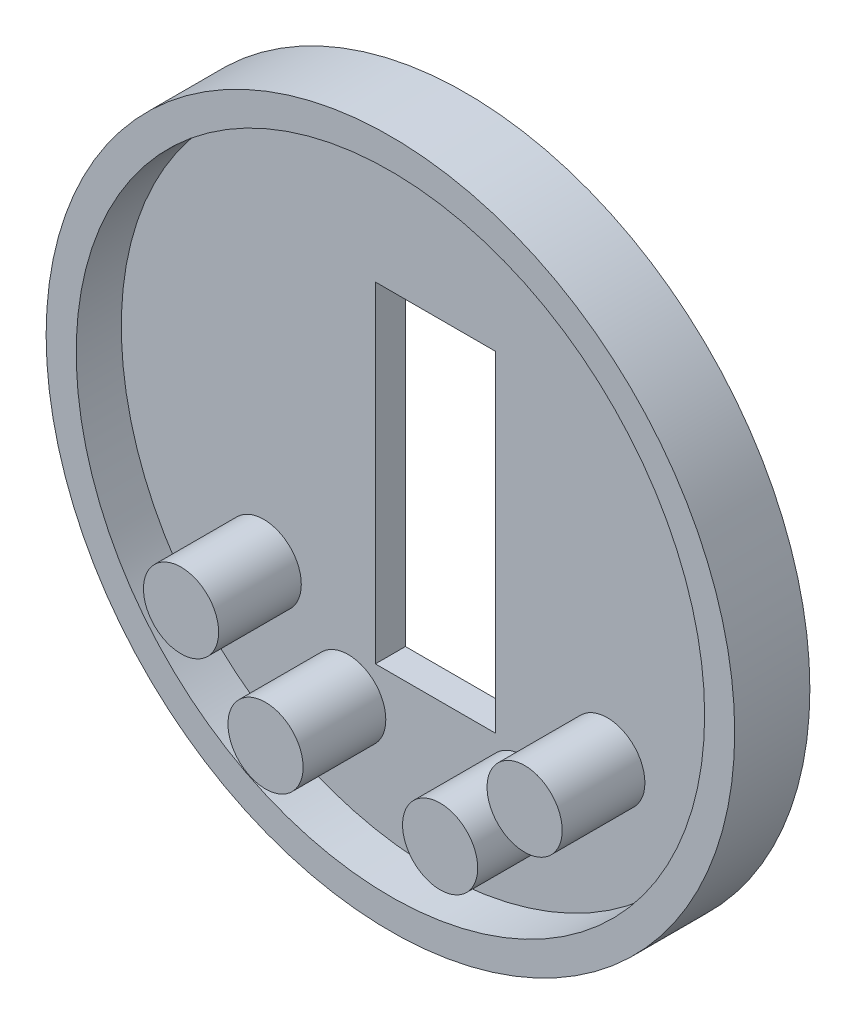
ISO-10303-21;
HEADER;
FILE_DESCRIPTION(('STEP AP214'),'2;1');
FILE_NAME('part.step','',(''),(''),'','','');
FILE_SCHEMA(('AUTOMOTIVE_DESIGN { 1 0 10303 214 1 1 1 1 }'));
ENDSEC;
DATA;
#1=APPLICATION_CONTEXT('core data for automotive mechanical design processes');
#2=APPLICATION_PROTOCOL_DEFINITION('international standard','automotive_design',2000,#1);
#3=PRODUCT_CONTEXT('',#1,'mechanical');
#4=PRODUCT('Part','Part','',(#3));
#5=PRODUCT_RELATED_PRODUCT_CATEGORY('part','',(#4));
#6=PRODUCT_DEFINITION_FORMATION('','',#4);
#7=PRODUCT_DEFINITION_CONTEXT('part definition',#1,'design');
#8=PRODUCT_DEFINITION('design','',#6,#7);
#9=PRODUCT_DEFINITION_SHAPE('','',#8);
#10=(LENGTH_UNIT() NAMED_UNIT(*) SI_UNIT(.MILLI.,.METRE.));
#11=(NAMED_UNIT(*) PLANE_ANGLE_UNIT() SI_UNIT($,.RADIAN.));
#12=(NAMED_UNIT(*) SI_UNIT($,.STERADIAN.) SOLID_ANGLE_UNIT());
#13=UNCERTAINTY_MEASURE_WITH_UNIT(LENGTH_MEASURE(1.E-05),#10,'distance_accuracy_value','');
#14=(GEOMETRIC_REPRESENTATION_CONTEXT(3) GLOBAL_UNCERTAINTY_ASSIGNED_CONTEXT((#13)) GLOBAL_UNIT_ASSIGNED_CONTEXT((#10,
#11,#12)) REPRESENTATION_CONTEXT('',''));
#15=CARTESIAN_POINT('',(0.,0.,0.));
#16=DIRECTION('',(0.,0.,1.));
#17=DIRECTION('',(1.,0.,0.));
#18=AXIS2_PLACEMENT_3D('',#15,#16,#17);
#19=CARTESIAN_POINT('',(0.,0.,0.));
#20=DIRECTION('',(0.,0.,-1.));
#21=DIRECTION('',(-1.,0.,0.));
#22=AXIS2_PLACEMENT_3D('',#19,#20,#21);
#23=PLANE('',#22);
#24=CARTESIAN_POINT('',(0.,0.,0.));
#25=DIRECTION('',(0.,0.,1.));
#26=DIRECTION('',(1.,0.,0.));
#27=AXIS2_PLACEMENT_3D('',#24,#25,#26);
#28=CIRCLE('',#27,22.902);
#29=CARTESIAN_POINT('',(22.902,0.,0.));
#30=VERTEX_POINT('',#29);
#31=EDGE_CURVE('E127',#30,#30,#28,.T.);
#32=ORIENTED_EDGE('',*,*,#31,.F.);
#33=EDGE_LOOP('',(#32));
#34=FACE_BOUND('',#33,.T.);
#35=DIRECTION('',(1.,0.,0.));
#36=VECTOR('',#35,1.);
#37=CARTESIAN_POINT('',(0.,11.,0.));
#38=LINE('',#37,#36);
#39=CARTESIAN_POINT('',(-4.,11.,0.));
#40=VERTEX_POINT('',#39);
#41=CARTESIAN_POINT('',(4.,11.,0.));
#42=VERTEX_POINT('',#41);
#43=EDGE_CURVE('E95',#40,#42,#38,.T.);
#44=ORIENTED_EDGE('',*,*,#43,.F.);
#45=DIRECTION('',(0.,-1.,0.));
#46=VECTOR('',#45,1.);
#47=CARTESIAN_POINT('',(-4.,0.,0.));
#48=LINE('',#47,#46);
#49=CARTESIAN_POINT('',(-4.,-11.,0.));
#50=VERTEX_POINT('',#49);
#51=EDGE_CURVE('E56',#40,#50,#48,.T.);
#52=ORIENTED_EDGE('',*,*,#51,.T.);
#53=DIRECTION('',(1.,0.,0.));
#54=VECTOR('',#53,1.);
#55=CARTESIAN_POINT('',(0.,-11.,0.));
#56=LINE('',#55,#54);
#57=CARTESIAN_POINT('',(4.,-11.,0.));
#58=VERTEX_POINT('',#57);
#59=EDGE_CURVE('E101',#50,#58,#56,.T.);
#60=ORIENTED_EDGE('',*,*,#59,.T.);
#61=DIRECTION('',(0.,-1.,0.));
#62=VECTOR('',#61,1.);
#63=CARTESIAN_POINT('',(4.,0.,0.));
#64=LINE('',#63,#62);
#65=EDGE_CURVE('E85',#42,#58,#64,.T.);
#66=ORIENTED_EDGE('',*,*,#65,.F.);
#67=EDGE_LOOP('',(#44,#52,#60,#66));
#68=FACE_BOUND('',#67,.T.);
#69=ADVANCED_FACE('F39',(#34,#68),#23,.T.);
#70=CARTESIAN_POINT('',(20.902,0.,2.));
#71=DIRECTION('',(0.,0.,1.));
#72=DIRECTION('',(1.,0.,0.));
#73=AXIS2_PLACEMENT_3D('',#70,#71,#72);
#74=PLANE('',#73);
#75=CARTESIAN_POINT('',(-11.4275,-8.885,2.));
#76=DIRECTION('',(0.,0.,1.));
#77=DIRECTION('',(1.,0.,0.));
#78=AXIS2_PLACEMENT_3D('',#75,#76,#77);
#79=CIRCLE('',#78,2.5);
#80=CARTESIAN_POINT('',(-8.9275,-8.885,2.));
#81=VERTEX_POINT('',#80);
#82=EDGE_CURVE('E42',#81,#81,#79,.F.);
#83=ORIENTED_EDGE('',*,*,#82,.T.);
#84=EDGE_LOOP('',(#83));
#85=FACE_BOUND('',#84,.T.);
#86=CARTESIAN_POINT('',(-5.8065,-13.863,2.));
#87=DIRECTION('',(0.,0.,1.));
#88=DIRECTION('',(1.,0.,0.));
#89=AXIS2_PLACEMENT_3D('',#86,#87,#88);
#90=CIRCLE('',#89,2.5);
#91=CARTESIAN_POINT('',(-3.3065,-13.863,2.));
#92=VERTEX_POINT('',#91);
#93=EDGE_CURVE('E148',#92,#92,#90,.F.);
#94=ORIENTED_EDGE('',*,*,#93,.T.);
#95=EDGE_LOOP('',(#94));
#96=FACE_BOUND('',#95,.T.);
#97=CARTESIAN_POINT('',(5.8065,-13.863,2.));
#98=DIRECTION('',(0.,0.,1.));
#99=DIRECTION('',(1.,0.,0.));
#100=AXIS2_PLACEMENT_3D('',#97,#98,#99);
#101=CIRCLE('',#100,2.5);
#102=CARTESIAN_POINT('',(8.3065,-13.863,2.));
#103=VERTEX_POINT('',#102);
#104=EDGE_CURVE('E144',#103,#103,#101,.F.);
#105=ORIENTED_EDGE('',*,*,#104,.T.);
#106=EDGE_LOOP('',(#105));
#107=FACE_BOUND('',#106,.T.);
#108=CARTESIAN_POINT('',(11.4275,-8.885,2.));
#109=DIRECTION('',(0.,0.,1.));
#110=DIRECTION('',(1.,0.,0.));
#111=AXIS2_PLACEMENT_3D('',#108,#109,#110);
#112=CIRCLE('',#111,2.5);
#113=CARTESIAN_POINT('',(13.9275,-8.885,2.));
#114=VERTEX_POINT('',#113);
#115=EDGE_CURVE('E139',#114,#114,#112,.F.);
#116=ORIENTED_EDGE('',*,*,#115,.T.);
#117=EDGE_LOOP('',(#116));
#118=FACE_BOUND('',#117,.T.);
#119=CARTESIAN_POINT('',(0.,0.,2.));
#120=DIRECTION('',(0.,0.,1.));
#121=DIRECTION('',(1.,0.,0.));
#122=AXIS2_PLACEMENT_3D('',#119,#120,#121);
#123=CIRCLE('',#122,20.902);
#124=CARTESIAN_POINT('',(20.902,0.,2.));
#125=VERTEX_POINT('',#124);
#126=EDGE_CURVE('E111',#125,#125,#123,.T.);
#127=ORIENTED_EDGE('',*,*,#126,.T.);
#128=EDGE_LOOP('',(#127));
#129=FACE_BOUND('',#128,.T.);
#130=DIRECTION('',(-1.,0.,0.));
#131=VECTOR('',#130,1.);
#132=CARTESIAN_POINT('',(20.902,-11.,2.));
#133=LINE('',#132,#131);
#134=CARTESIAN_POINT('',(4.,-11.,2.));
#135=VERTEX_POINT('',#134);
#136=CARTESIAN_POINT('',(-4.,-11.,2.));
#137=VERTEX_POINT('',#136);
#138=EDGE_CURVE('E48',#135,#137,#133,.T.);
#139=ORIENTED_EDGE('',*,*,#138,.T.);
#140=DIRECTION('',(0.,1.,0.));
#141=VECTOR('',#140,1.);
#142=CARTESIAN_POINT('',(-4.,0.,2.));
#143=LINE('',#142,#141);
#144=CARTESIAN_POINT('',(-4.,11.,2.));
#145=VERTEX_POINT('',#144);
#146=EDGE_CURVE('E11',#137,#145,#143,.T.);
#147=ORIENTED_EDGE('',*,*,#146,.T.);
#148=DIRECTION('',(-1.,0.,0.));
#149=VECTOR('',#148,1.);
#150=CARTESIAN_POINT('',(20.902,11.,2.));
#151=LINE('',#150,#149);
#152=CARTESIAN_POINT('',(4.,11.,2.));
#153=VERTEX_POINT('',#152);
#154=EDGE_CURVE('E131',#153,#145,#151,.T.);
#155=ORIENTED_EDGE('',*,*,#154,.F.);
#156=DIRECTION('',(0.,1.,0.));
#157=VECTOR('',#156,1.);
#158=CARTESIAN_POINT('',(4.,0.,2.));
#159=LINE('',#158,#157);
#160=EDGE_CURVE('E88',#135,#153,#159,.T.);
#161=ORIENTED_EDGE('',*,*,#160,.F.);
#162=EDGE_LOOP('',(#139,#147,#155,#161));
#163=FACE_BOUND('',#162,.T.);
#164=ADVANCED_FACE('F188',(#85,#96,#107,#118,#129,#163),#74,.T.);
#165=CARTESIAN_POINT('',(0.,0.,2.));
#166=DIRECTION('',(0.,0.,1.));
#167=DIRECTION('',(1.,0.,0.));
#168=AXIS2_PLACEMENT_3D('',#165,#166,#167);
#169=CYLINDRICAL_SURFACE('',#168,22.902);
#170=ORIENTED_EDGE('',*,*,#31,.T.);
#171=EDGE_LOOP('',(#170));
#172=FACE_BOUND('',#171,.T.);
#173=CARTESIAN_POINT('',(0.,0.,5.));
#174=DIRECTION('',(0.,0.,1.));
#175=DIRECTION('',(1.,0.,0.));
#176=AXIS2_PLACEMENT_3D('',#173,#174,#175);
#177=CIRCLE('',#176,22.902);
#178=CARTESIAN_POINT('',(22.902,0.,5.));
#179=VERTEX_POINT('',#178);
#180=EDGE_CURVE('E123',#179,#179,#177,.T.);
#181=ORIENTED_EDGE('',*,*,#180,.F.);
#182=EDGE_LOOP('',(#181));
#183=FACE_BOUND('',#182,.T.);
#184=ADVANCED_FACE('F194',(#172,#183),#169,.T.);
#185=CARTESIAN_POINT('',(22.902,0.,5.));
#186=DIRECTION('',(0.,0.,1.));
#187=DIRECTION('',(1.,0.,0.));
#188=AXIS2_PLACEMENT_3D('',#185,#186,#187);
#189=PLANE('',#188);
#190=ORIENTED_EDGE('',*,*,#180,.T.);
#191=EDGE_LOOP('',(#190));
#192=FACE_BOUND('',#191,.T.);
#193=CARTESIAN_POINT('',(0.,0.,5.));
#194=DIRECTION('',(0.,0.,1.));
#195=DIRECTION('',(1.,0.,0.));
#196=AXIS2_PLACEMENT_3D('',#193,#194,#195);
#197=CIRCLE('',#196,20.902);
#198=CARTESIAN_POINT('',(20.902,0.,5.));
#199=VERTEX_POINT('',#198);
#200=EDGE_CURVE('E119',#199,#199,#197,.T.);
#201=ORIENTED_EDGE('',*,*,#200,.F.);
#202=EDGE_LOOP('',(#201));
#203=FACE_BOUND('',#202,.T.);
#204=ADVANCED_FACE('F201',(#192,#203),#189,.T.);
#205=CARTESIAN_POINT('',(0.,0.,2.));
#206=DIRECTION('',(0.,0.,1.));
#207=DIRECTION('',(1.,0.,0.));
#208=AXIS2_PLACEMENT_3D('',#205,#206,#207);
#209=CYLINDRICAL_SURFACE('',#208,20.902);
#210=ORIENTED_EDGE('',*,*,#200,.T.);
#211=EDGE_LOOP('',(#210));
#212=FACE_BOUND('',#211,.T.);
#213=ORIENTED_EDGE('',*,*,#126,.F.);
#214=EDGE_LOOP('',(#213));
#215=FACE_BOUND('',#214,.T.);
#216=ADVANCED_FACE('F206',(#212,#215),#209,.F.);
#217=CARTESIAN_POINT('',(-4.,0.,10.));
#218=DIRECTION('',(1.,0.,0.));
#219=DIRECTION('',(0.,0.,-1.));
#220=AXIS2_PLACEMENT_3D('',#217,#218,#219);
#221=PLANE('',#220);
#222=DIRECTION('',(0.,0.,-1.));
#223=VECTOR('',#222,1.);
#224=CARTESIAN_POINT('',(-4.,-11.,10.));
#225=LINE('',#224,#223);
#226=EDGE_CURVE('E108',#137,#50,#225,.T.);
#227=ORIENTED_EDGE('',*,*,#226,.T.);
#228=ORIENTED_EDGE('',*,*,#51,.F.);
#229=DIRECTION('',(0.,0.,-1.));
#230=VECTOR('',#229,1.);
#231=CARTESIAN_POINT('',(-4.,11.,10.));
#232=LINE('',#231,#230);
#233=EDGE_CURVE('E92',#145,#40,#232,.T.);
#234=ORIENTED_EDGE('',*,*,#233,.F.);
#235=ORIENTED_EDGE('',*,*,#146,.F.);
#236=EDGE_LOOP('',(#227,#228,#234,#235));
#237=FACE_BOUND('',#236,.T.);
#238=ADVANCED_FACE('F212',(#237),#221,.T.);
#239=CARTESIAN_POINT('',(0.,-11.,10.));
#240=DIRECTION('',(0.,1.,0.));
#241=DIRECTION('',(0.,0.,1.));
#242=AXIS2_PLACEMENT_3D('',#239,#240,#241);
#243=PLANE('',#242);
#244=DIRECTION('',(0.,0.,-1.));
#245=VECTOR('',#244,1.);
#246=CARTESIAN_POINT('',(4.,-11.,10.));
#247=LINE('',#246,#245);
#248=EDGE_CURVE('E91',#135,#58,#247,.T.);
#249=ORIENTED_EDGE('',*,*,#248,.T.);
#250=ORIENTED_EDGE('',*,*,#59,.F.);
#251=ORIENTED_EDGE('',*,*,#226,.F.);
#252=ORIENTED_EDGE('',*,*,#138,.F.);
#253=EDGE_LOOP('',(#249,#250,#251,#252));
#254=FACE_BOUND('',#253,.T.);
#255=ADVANCED_FACE('F219',(#254),#243,.T.);
#256=CARTESIAN_POINT('',(4.,0.,10.));
#257=DIRECTION('',(1.,0.,0.));
#258=DIRECTION('',(0.,1.,0.));
#259=AXIS2_PLACEMENT_3D('',#256,#257,#258);
#260=PLANE('',#259);
#261=ORIENTED_EDGE('',*,*,#160,.T.);
#262=DIRECTION('',(0.,0.,-1.));
#263=VECTOR('',#262,1.);
#264=CARTESIAN_POINT('',(4.,11.,10.));
#265=LINE('',#264,#263);
#266=EDGE_CURVE('E64',#153,#42,#265,.T.);
#267=ORIENTED_EDGE('',*,*,#266,.T.);
#268=ORIENTED_EDGE('',*,*,#65,.T.);
#269=ORIENTED_EDGE('',*,*,#248,.F.);
#270=EDGE_LOOP('',(#261,#267,#268,#269));
#271=FACE_BOUND('',#270,.T.);
#272=ADVANCED_FACE('F82',(#271),#260,.F.);
#273=CARTESIAN_POINT('',(0.,11.,10.));
#274=DIRECTION('',(0.,1.,0.));
#275=DIRECTION('',(0.,0.,1.));
#276=AXIS2_PLACEMENT_3D('',#273,#274,#275);
#277=PLANE('',#276);
#278=ORIENTED_EDGE('',*,*,#154,.T.);
#279=ORIENTED_EDGE('',*,*,#233,.T.);
#280=ORIENTED_EDGE('',*,*,#43,.T.);
#281=ORIENTED_EDGE('',*,*,#266,.F.);
#282=EDGE_LOOP('',(#278,#279,#280,#281));
#283=FACE_BOUND('',#282,.T.);
#284=ADVANCED_FACE('F96',(#283),#277,.F.);
#285=CARTESIAN_POINT('',(11.4275,-8.885,7.5));
#286=DIRECTION('',(0.,0.,-1.));
#287=DIRECTION('',(-1.,0.,0.));
#288=AXIS2_PLACEMENT_3D('',#285,#286,#287);
#289=CYLINDRICAL_SURFACE('',#288,2.5);
#290=ORIENTED_EDGE('',*,*,#115,.F.);
#291=EDGE_LOOP('',(#290));
#292=FACE_BOUND('',#291,.T.);
#293=CARTESIAN_POINT('',(11.4275,-8.885,7.5));
#294=DIRECTION('',(0.,0.,1.));
#295=DIRECTION('',(1.,0.,0.));
#296=AXIS2_PLACEMENT_3D('',#293,#294,#295);
#297=CIRCLE('',#296,2.5);
#298=CARTESIAN_POINT('',(13.9275,-8.885,7.5));
#299=VERTEX_POINT('',#298);
#300=EDGE_CURVE('E143',#299,#299,#297,.T.);
#301=ORIENTED_EDGE('',*,*,#300,.F.);
#302=EDGE_LOOP('',(#301));
#303=FACE_BOUND('',#302,.T.);
#304=ADVANCED_FACE('F174',(#292,#303),#289,.T.);
#305=CARTESIAN_POINT('',(11.4275,-8.885,7.5));
#306=DIRECTION('',(0.,0.,1.));
#307=DIRECTION('',(1.,0.,0.));
#308=AXIS2_PLACEMENT_3D('',#305,#306,#307);
#309=PLANE('',#308);
#310=ORIENTED_EDGE('',*,*,#300,.T.);
#311=EDGE_LOOP('',(#310));
#312=FACE_BOUND('',#311,.T.);
#313=ADVANCED_FACE('F172',(#312),#309,.T.);
#314=CARTESIAN_POINT('',(5.8065,-13.863,7.5));
#315=DIRECTION('',(0.,0.,-1.));
#316=DIRECTION('',(-1.,0.,0.));
#317=AXIS2_PLACEMENT_3D('',#314,#315,#316);
#318=CYLINDRICAL_SURFACE('',#317,2.5);
#319=ORIENTED_EDGE('',*,*,#104,.F.);
#320=EDGE_LOOP('',(#319));
#321=FACE_BOUND('',#320,.T.);
#322=CARTESIAN_POINT('',(5.8065,-13.863,7.5));
#323=DIRECTION('',(0.,0.,1.));
#324=DIRECTION('',(1.,0.,0.));
#325=AXIS2_PLACEMENT_3D('',#322,#323,#324);
#326=CIRCLE('',#325,2.5);
#327=CARTESIAN_POINT('',(8.3065,-13.863,7.5));
#328=VERTEX_POINT('',#327);
#329=EDGE_CURVE('E147',#328,#328,#326,.T.);
#330=ORIENTED_EDGE('',*,*,#329,.F.);
#331=EDGE_LOOP('',(#330));
#332=FACE_BOUND('',#331,.T.);
#333=ADVANCED_FACE('F182',(#321,#332),#318,.T.);
#334=CARTESIAN_POINT('',(0.,0.,7.5));
#335=DIRECTION('',(0.,0.,1.));
#336=DIRECTION('',(1.,0.,0.));
#337=AXIS2_PLACEMENT_3D('',#334,#335,#336);
#338=PLANE('',#337);
#339=ORIENTED_EDGE('',*,*,#329,.T.);
#340=EDGE_LOOP('',(#339));
#341=FACE_BOUND('',#340,.T.);
#342=ADVANCED_FACE('F254',(#341),#338,.T.);
#343=CARTESIAN_POINT('',(-5.8065,-13.863,7.5));
#344=DIRECTION('',(0.,0.,-1.));
#345=DIRECTION('',(-1.,0.,0.));
#346=AXIS2_PLACEMENT_3D('',#343,#344,#345);
#347=CYLINDRICAL_SURFACE('',#346,2.5);
#348=ORIENTED_EDGE('',*,*,#93,.F.);
#349=EDGE_LOOP('',(#348));
#350=FACE_BOUND('',#349,.T.);
#351=CARTESIAN_POINT('',(-5.8065,-13.863,7.5));
#352=DIRECTION('',(0.,0.,1.));
#353=DIRECTION('',(1.,0.,0.));
#354=AXIS2_PLACEMENT_3D('',#351,#352,#353);
#355=CIRCLE('',#354,2.5);
#356=CARTESIAN_POINT('',(-3.3065,-13.863,7.5));
#357=VERTEX_POINT('',#356);
#358=EDGE_CURVE('E151',#357,#357,#355,.T.);
#359=ORIENTED_EDGE('',*,*,#358,.F.);
#360=EDGE_LOOP('',(#359));
#361=FACE_BOUND('',#360,.T.);
#362=ADVANCED_FACE('F264',(#350,#361),#347,.T.);
#363=CARTESIAN_POINT('',(0.,0.,7.5));
#364=DIRECTION('',(0.,0.,1.));
#365=DIRECTION('',(1.,0.,0.));
#366=AXIS2_PLACEMENT_3D('',#363,#364,#365);
#367=PLANE('',#366);
#368=ORIENTED_EDGE('',*,*,#358,.T.);
#369=EDGE_LOOP('',(#368));
#370=FACE_BOUND('',#369,.T.);
#371=ADVANCED_FACE('F273',(#370),#367,.T.);
#372=CARTESIAN_POINT('',(-11.4275,-8.885,7.5));
#373=DIRECTION('',(0.,0.,-1.));
#374=DIRECTION('',(-1.,0.,0.));
#375=AXIS2_PLACEMENT_3D('',#372,#373,#374);
#376=CYLINDRICAL_SURFACE('',#375,2.5);
#377=ORIENTED_EDGE('',*,*,#82,.F.);
#378=EDGE_LOOP('',(#377));
#379=FACE_BOUND('',#378,.T.);
#380=CARTESIAN_POINT('',(-11.4275,-8.885,7.5));
#381=DIRECTION('',(0.,0.,1.));
#382=DIRECTION('',(1.,0.,0.));
#383=AXIS2_PLACEMENT_3D('',#380,#381,#382);
#384=CIRCLE('',#383,2.5);
#385=CARTESIAN_POINT('',(-8.9275,-8.885,7.5));
#386=VERTEX_POINT('',#385);
#387=EDGE_CURVE('E164',#386,#386,#384,.T.);
#388=ORIENTED_EDGE('',*,*,#387,.F.);
#389=EDGE_LOOP('',(#388));
#390=FACE_BOUND('',#389,.T.);
#391=ADVANCED_FACE('F282',(#379,#390),#376,.T.);
#392=CARTESIAN_POINT('',(-11.4275,-8.885,7.5));
#393=DIRECTION('',(0.,0.,1.));
#394=DIRECTION('',(1.,0.,0.));
#395=AXIS2_PLACEMENT_3D('',#392,#393,#394);
#396=PLANE('',#395);
#397=ORIENTED_EDGE('',*,*,#387,.T.);
#398=EDGE_LOOP('',(#397));
#399=FACE_BOUND('',#398,.T.);
#400=ADVANCED_FACE('F292',(#399),#396,.T.);
#401=CLOSED_SHELL('',(#69,#164,#184,#204,#216,#238,#255,#272,#284,#304,#313,#333,#342,#362,#371,
#391,#400));
#402=MANIFOLD_SOLID_BREP('B2',#401);
#403=ADVANCED_BREP_SHAPE_REPRESENTATION('',(#18,#402),#14);
#404=SHAPE_DEFINITION_REPRESENTATION(#9,#403);
ENDSEC;
END-ISO-10303-21;
